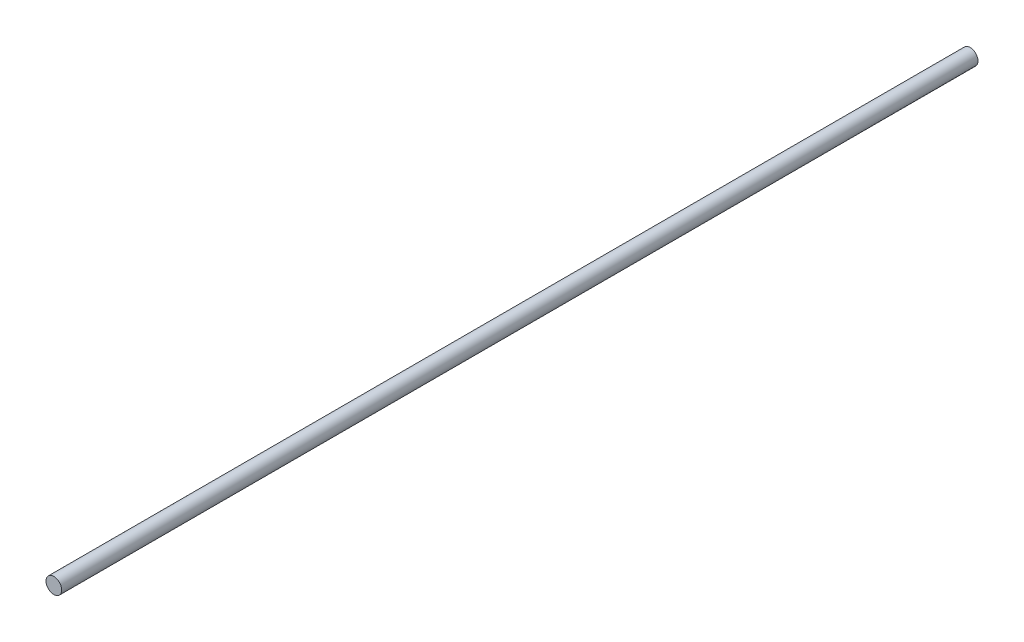
ISO-10303-21;
HEADER;
FILE_DESCRIPTION(('STEP AP214'),'2;1');
FILE_NAME('part.step','',(''),(''),'','','');
FILE_SCHEMA(('AUTOMOTIVE_DESIGN { 1 0 10303 214 1 1 1 1 }'));
ENDSEC;
DATA;
#1=APPLICATION_CONTEXT('core data for automotive mechanical design processes');
#2=APPLICATION_PROTOCOL_DEFINITION('international standard','automotive_design',2000,#1);
#3=PRODUCT_CONTEXT('',#1,'mechanical');
#4=PRODUCT('Part','Part','',(#3));
#5=PRODUCT_RELATED_PRODUCT_CATEGORY('part','',(#4));
#6=PRODUCT_DEFINITION_FORMATION('','',#4);
#7=PRODUCT_DEFINITION_CONTEXT('part definition',#1,'design');
#8=PRODUCT_DEFINITION('design','',#6,#7);
#9=PRODUCT_DEFINITION_SHAPE('','',#8);
#10=(LENGTH_UNIT() NAMED_UNIT(*) SI_UNIT(.MILLI.,.METRE.));
#11=(NAMED_UNIT(*) PLANE_ANGLE_UNIT() SI_UNIT($,.RADIAN.));
#12=(NAMED_UNIT(*) SI_UNIT($,.STERADIAN.) SOLID_ANGLE_UNIT());
#13=UNCERTAINTY_MEASURE_WITH_UNIT(LENGTH_MEASURE(1.E-05),#10,'distance_accuracy_value','');
#14=(GEOMETRIC_REPRESENTATION_CONTEXT(3) GLOBAL_UNCERTAINTY_ASSIGNED_CONTEXT((#13)) GLOBAL_UNIT_ASSIGNED_CONTEXT((#10,
#11,#12)) REPRESENTATION_CONTEXT('',''));
#15=CARTESIAN_POINT('',(0.,0.,0.));
#16=DIRECTION('',(0.,0.,1.));
#17=DIRECTION('',(1.,0.,0.));
#18=AXIS2_PLACEMENT_3D('',#15,#16,#17);
#19=CARTESIAN_POINT('',(-32.4094773450322,8.43173394342302,350.));
#20=DIRECTION('',(0.,0.,-1.));
#21=DIRECTION('',(-1.,0.,0.));
#22=AXIS2_PLACEMENT_3D('',#19,#20,#21);
#23=CYLINDRICAL_SURFACE('',#22,3.);
#24=CARTESIAN_POINT('',(-32.4094773450322,8.43173394342302,350.));
#25=DIRECTION('',(0.,0.,1.));
#26=DIRECTION('',(1.,0.,0.));
#27=AXIS2_PLACEMENT_3D('',#24,#25,#26);
#28=CIRCLE('',#27,3.);
#29=CARTESIAN_POINT('',(-29.4094773450322,8.43173394342302,350.));
#30=VERTEX_POINT('',#29);
#31=EDGE_CURVE('E10',#30,#30,#28,.T.);
#32=ORIENTED_EDGE('',*,*,#31,.F.);
#33=EDGE_LOOP('',(#32));
#34=FACE_BOUND('',#33,.T.);
#35=CARTESIAN_POINT('',(-32.4094773450322,8.43173394342302,0.));
#36=DIRECTION('',(0.,0.,1.));
#37=DIRECTION('',(1.,0.,0.));
#38=AXIS2_PLACEMENT_3D('',#35,#36,#37);
#39=CIRCLE('',#38,3.);
#40=CARTESIAN_POINT('',(-29.4094773450322,8.43173394342302,0.));
#41=VERTEX_POINT('',#40);
#42=EDGE_CURVE('E42',#41,#41,#39,.T.);
#43=ORIENTED_EDGE('',*,*,#42,.T.);
#44=EDGE_LOOP('',(#43));
#45=FACE_BOUND('',#44,.T.);
#46=ADVANCED_FACE('F39',(#34,#45),#23,.T.);
#47=CARTESIAN_POINT('',(-32.4094773450322,8.43173394342302,350.));
#48=DIRECTION('',(0.,0.,1.));
#49=DIRECTION('',(1.,0.,0.));
#50=AXIS2_PLACEMENT_3D('',#47,#48,#49);
#51=PLANE('',#50);
#52=ORIENTED_EDGE('',*,*,#31,.T.);
#53=EDGE_LOOP('',(#52));
#54=FACE_BOUND('',#53,.T.);
#55=ADVANCED_FACE('F54',(#54),#51,.T.);
#56=CARTESIAN_POINT('',(-32.4094773450322,8.43173394342302,0.));
#57=DIRECTION('',(0.,0.,1.));
#58=DIRECTION('',(1.,0.,0.));
#59=AXIS2_PLACEMENT_3D('',#56,#57,#58);
#60=PLANE('',#59);
#61=ORIENTED_EDGE('',*,*,#42,.F.);
#62=EDGE_LOOP('',(#61));
#63=FACE_BOUND('',#62,.T.);
#64=ADVANCED_FACE('F52',(#63),#60,.F.);
#65=CLOSED_SHELL('',(#46,#55,#64));
#66=MANIFOLD_SOLID_BREP('B2',#65);
#67=ADVANCED_BREP_SHAPE_REPRESENTATION('',(#18,#66),#14);
#68=SHAPE_DEFINITION_REPRESENTATION(#9,#67);
ENDSEC;
END-ISO-10303-21;
